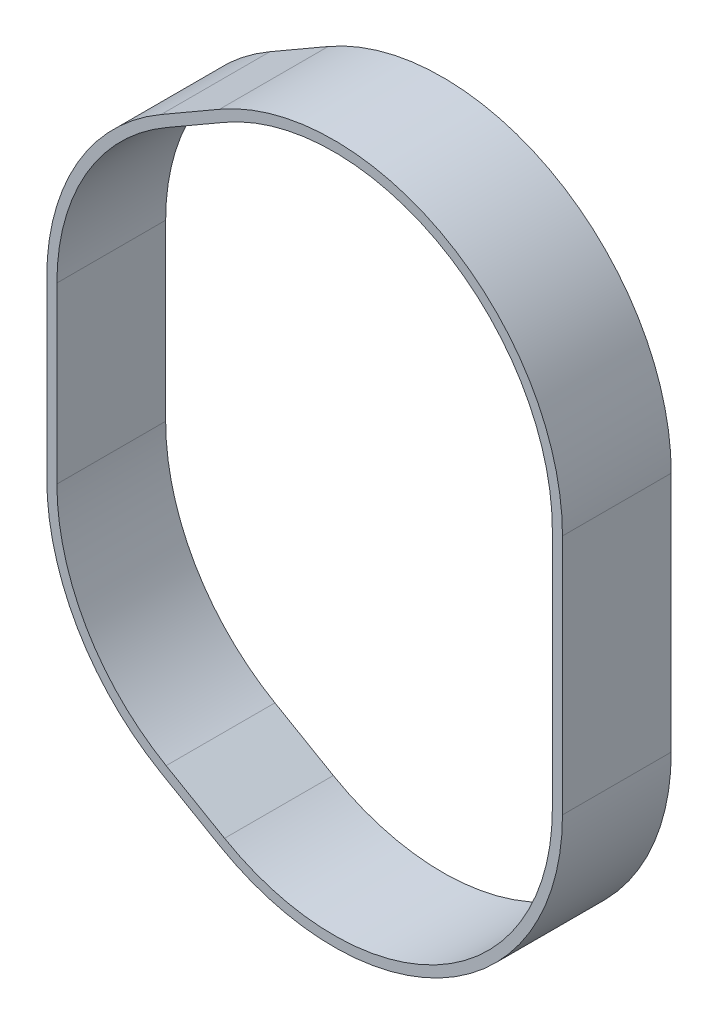
ISO-10303-21;
HEADER;
FILE_DESCRIPTION(('STEP AP214'),'2;1');
FILE_NAME('part.step','',(''),(''),'','','');
FILE_SCHEMA(('AUTOMOTIVE_DESIGN { 1 0 10303 214 1 1 1 1 }'));
ENDSEC;
DATA;
#1=APPLICATION_CONTEXT('core data for automotive mechanical design processes');
#2=APPLICATION_PROTOCOL_DEFINITION('international standard','automotive_design',2000,#1);
#3=PRODUCT_CONTEXT('',#1,'mechanical');
#4=PRODUCT('Part','Part','',(#3));
#5=PRODUCT_RELATED_PRODUCT_CATEGORY('part','',(#4));
#6=PRODUCT_DEFINITION_FORMATION('','',#4);
#7=PRODUCT_DEFINITION_CONTEXT('part definition',#1,'design');
#8=PRODUCT_DEFINITION('design','',#6,#7);
#9=PRODUCT_DEFINITION_SHAPE('','',#8);
#10=(LENGTH_UNIT() NAMED_UNIT(*) SI_UNIT(.MILLI.,.METRE.));
#11=(NAMED_UNIT(*) PLANE_ANGLE_UNIT() SI_UNIT($,.RADIAN.));
#12=(NAMED_UNIT(*) SI_UNIT($,.STERADIAN.) SOLID_ANGLE_UNIT());
#13=UNCERTAINTY_MEASURE_WITH_UNIT(LENGTH_MEASURE(1.E-05),#10,'distance_accuracy_value','');
#14=(GEOMETRIC_REPRESENTATION_CONTEXT(3) GLOBAL_UNCERTAINTY_ASSIGNED_CONTEXT((#13)) GLOBAL_UNIT_ASSIGNED_CONTEXT((#10,
#11,#12)) REPRESENTATION_CONTEXT('',''));
#15=CARTESIAN_POINT('',(0.,0.,0.));
#16=DIRECTION('',(0.,0.,1.));
#17=DIRECTION('',(1.,0.,0.));
#18=AXIS2_PLACEMENT_3D('',#15,#16,#17);
#19=CARTESIAN_POINT('',(181.562482571108,-4.12570780554714E-13,43.5));
#20=DIRECTION('',(-1.,0.,0.));
#21=DIRECTION('',(0.,-1.,0.));
#22=AXIS2_PLACEMENT_3D('',#19,#20,#21);
#23=PLANE('',#22);
#24=DIRECTION('',(0.,1.,0.));
#25=VECTOR('',#24,1.);
#26=CARTESIAN_POINT('',(181.562482571108,-4.12570780554714E-13,21.5));
#27=LINE('',#26,#25);
#28=CARTESIAN_POINT('',(181.562482571108,-24.4291232025115,21.5));
#29=VERTEX_POINT('',#28);
#30=CARTESIAN_POINT('',(181.562482571109,24.4291232025113,21.5));
#31=VERTEX_POINT('',#30);
#32=EDGE_CURVE('E211',#29,#31,#27,.T.);
#33=ORIENTED_EDGE('',*,*,#32,.T.);
#34=DIRECTION('',(0.,0.,-1.));
#35=VECTOR('',#34,1.);
#36=CARTESIAN_POINT('',(181.562482571109,24.4291232025113,43.5));
#37=LINE('',#36,#35);
#38=CARTESIAN_POINT('',(181.562482571109,24.4291232025113,43.5));
#39=VERTEX_POINT('',#38);
#40=EDGE_CURVE('E218',#39,#31,#37,.T.);
#41=ORIENTED_EDGE('',*,*,#40,.F.);
#42=DIRECTION('',(0.,1.,0.));
#43=VECTOR('',#42,1.);
#44=CARTESIAN_POINT('',(181.562482571108,-4.12570780554714E-13,43.5));
#45=LINE('',#44,#43);
#46=CARTESIAN_POINT('',(181.562482571108,-24.4291232025115,43.5));
#47=VERTEX_POINT('',#46);
#48=EDGE_CURVE('E187',#47,#39,#45,.T.);
#49=ORIENTED_EDGE('',*,*,#48,.F.);
#50=DIRECTION('',(0.,0.,-1.));
#51=VECTOR('',#50,1.);
#52=CARTESIAN_POINT('',(181.562482571108,-24.4291232025115,43.5));
#53=LINE('',#52,#51);
#54=EDGE_CURVE('E214',#47,#29,#53,.T.);
#55=ORIENTED_EDGE('',*,*,#54,.T.);
#56=EDGE_LOOP('',(#33,#41,#49,#55));
#57=FACE_BOUND('',#56,.T.);
#58=ADVANCED_FACE('F36',(#57),#23,.F.);
#59=CARTESIAN_POINT('',(135.312482571108,24.4291232025113,43.5));
#60=DIRECTION('',(0.,0.,-1.));
#61=DIRECTION('',(-1.,0.,0.));
#62=AXIS2_PLACEMENT_3D('',#59,#60,#61);
#63=CYLINDRICAL_SURFACE('',#62,46.2499999999999);
#64=CARTESIAN_POINT('',(135.312482571108,24.4291232025113,21.5));
#65=DIRECTION('',(0.,0.,1.));
#66=DIRECTION('',(1.,0.,0.));
#67=AXIS2_PLACEMENT_3D('',#64,#65,#66);
#68=CIRCLE('',#67,46.2499999999999);
#69=CARTESIAN_POINT('',(112.187482571102,64.4827981275377,21.5));
#70=VERTEX_POINT('',#69);
#71=EDGE_CURVE('E215',#31,#70,#68,.T.);
#72=ORIENTED_EDGE('',*,*,#71,.T.);
#73=DIRECTION('',(0.,0.,-1.));
#74=VECTOR('',#73,1.);
#75=CARTESIAN_POINT('',(112.187482571102,64.4827981275377,43.5));
#76=LINE('',#75,#74);
#77=CARTESIAN_POINT('',(112.187482571102,64.4827981275377,43.5));
#78=VERTEX_POINT('',#77);
#79=EDGE_CURVE('E222',#78,#70,#76,.T.);
#80=ORIENTED_EDGE('',*,*,#79,.F.);
#81=CARTESIAN_POINT('',(135.312482571108,24.4291232025113,43.5));
#82=DIRECTION('',(0.,0.,1.));
#83=DIRECTION('',(1.,0.,0.));
#84=AXIS2_PLACEMENT_3D('',#81,#82,#83);
#85=CIRCLE('',#84,46.2499999999999);
#86=EDGE_CURVE('E190',#39,#78,#85,.T.);
#87=ORIENTED_EDGE('',*,*,#86,.F.);
#88=ORIENTED_EDGE('',*,*,#40,.T.);
#89=EDGE_LOOP('',(#72,#80,#87,#88));
#90=FACE_BOUND('',#89,.T.);
#91=ADVANCED_FACE('F260',(#90),#63,.T.);
#92=CARTESIAN_POINT('',(0.125000000003151,-0.216506350951542,43.5));
#93=DIRECTION('',(0.500000000000043,-0.866025403784414,0.));
#94=DIRECTION('',(0.866025403784414,0.500000000000043,0.));
#95=AXIS2_PLACEMENT_3D('',#92,#93,#94);
#96=PLANE('',#95);
#97=DIRECTION('',(-0.866025403784414,-0.500000000000043,0.));
#98=VECTOR('',#97,1.);
#99=CARTESIAN_POINT('',(0.125000000003151,-0.216506350951542,21.5));
#100=LINE('',#99,#98);
#101=CARTESIAN_POINT('',(100.37499999995,57.6628581352844,21.5));
#102=VERTEX_POINT('',#101);
#103=EDGE_CURVE('E219',#70,#102,#100,.T.);
#104=ORIENTED_EDGE('',*,*,#103,.T.);
#105=DIRECTION('',(0.,0.,-1.));
#106=VECTOR('',#105,1.);
#107=CARTESIAN_POINT('',(100.37499999995,57.6628581352844,43.5));
#108=LINE('',#107,#106);
#109=CARTESIAN_POINT('',(100.37499999995,57.6628581352844,43.5));
#110=VERTEX_POINT('',#109);
#111=EDGE_CURVE('E226',#110,#102,#108,.T.);
#112=ORIENTED_EDGE('',*,*,#111,.F.);
#113=DIRECTION('',(-0.866025403784414,-0.500000000000043,0.));
#114=VECTOR('',#113,1.);
#115=CARTESIAN_POINT('',(0.125000000003151,-0.216506350951542,43.5));
#116=LINE('',#115,#114);
#117=EDGE_CURVE('E194',#78,#110,#116,.T.);
#118=ORIENTED_EDGE('',*,*,#117,.F.);
#119=ORIENTED_EDGE('',*,*,#79,.T.);
#120=EDGE_LOOP('',(#104,#112,#118,#119));
#121=FACE_BOUND('',#120,.T.);
#122=ADVANCED_FACE('F304',(#121),#96,.F.);
#123=CARTESIAN_POINT('',(123.5,17.6091832102842,43.5));
#124=DIRECTION('',(0.,0.,-1.));
#125=DIRECTION('',(-1.,0.,0.));
#126=AXIS2_PLACEMENT_3D('',#123,#124,#125);
#127=CYLINDRICAL_SURFACE('',#126,46.249999999999);
#128=CARTESIAN_POINT('',(123.5,17.6091832102842,21.5));
#129=DIRECTION('',(0.,0.,1.));
#130=DIRECTION('',(1.,0.,0.));
#131=AXIS2_PLACEMENT_3D('',#128,#129,#130);
#132=CIRCLE('',#131,46.249999999999);
#133=CARTESIAN_POINT('',(77.2500000000009,17.6091832102842,21.5));
#134=VERTEX_POINT('',#133);
#135=EDGE_CURVE('E223',#102,#134,#132,.T.);
#136=ORIENTED_EDGE('',*,*,#135,.T.);
#137=DIRECTION('',(0.,0.,-1.));
#138=VECTOR('',#137,1.);
#139=CARTESIAN_POINT('',(77.2500000000009,17.6091832102842,43.5));
#140=LINE('',#139,#138);
#141=CARTESIAN_POINT('',(77.2500000000009,17.6091832102842,43.5));
#142=VERTEX_POINT('',#141);
#143=EDGE_CURVE('E230',#142,#134,#140,.T.);
#144=ORIENTED_EDGE('',*,*,#143,.F.);
#145=CARTESIAN_POINT('',(123.5,17.6091832102842,43.5));
#146=DIRECTION('',(0.,0.,1.));
#147=DIRECTION('',(1.,0.,0.));
#148=AXIS2_PLACEMENT_3D('',#145,#146,#147);
#149=CIRCLE('',#148,46.249999999999);
#150=EDGE_CURVE('E197',#110,#142,#149,.T.);
#151=ORIENTED_EDGE('',*,*,#150,.F.);
#152=ORIENTED_EDGE('',*,*,#111,.T.);
#153=EDGE_LOOP('',(#136,#144,#151,#152));
#154=FACE_BOUND('',#153,.T.);
#155=ADVANCED_FACE('F307',(#154),#127,.T.);
#156=CARTESIAN_POINT('',(77.2500000000004,-1.94818186915581E-12,43.5));
#157=DIRECTION('',(1.,0.,0.));
#158=DIRECTION('',(0.,1.,0.));
#159=AXIS2_PLACEMENT_3D('',#156,#157,#158);
#160=PLANE('',#159);
#161=DIRECTION('',(0.,-1.,0.));
#162=VECTOR('',#161,1.);
#163=CARTESIAN_POINT('',(77.2500000000004,-1.94818186915581E-12,21.5));
#164=LINE('',#163,#162);
#165=CARTESIAN_POINT('',(77.25,-17.6091832102831,21.5));
#166=VERTEX_POINT('',#165);
#167=EDGE_CURVE('E227',#134,#166,#164,.T.);
#168=ORIENTED_EDGE('',*,*,#167,.T.);
#169=DIRECTION('',(0.,0.,-1.));
#170=VECTOR('',#169,1.);
#171=CARTESIAN_POINT('',(77.25,-17.6091832102831,43.5));
#172=LINE('',#171,#170);
#173=CARTESIAN_POINT('',(77.25,-17.6091832102831,43.5));
#174=VERTEX_POINT('',#173);
#175=EDGE_CURVE('E234',#174,#166,#172,.T.);
#176=ORIENTED_EDGE('',*,*,#175,.F.);
#177=DIRECTION('',(0.,-1.,0.));
#178=VECTOR('',#177,1.);
#179=CARTESIAN_POINT('',(77.2500000000004,-1.94818186915581E-12,43.5));
#180=LINE('',#179,#178);
#181=EDGE_CURVE('E200',#142,#174,#180,.T.);
#182=ORIENTED_EDGE('',*,*,#181,.F.);
#183=ORIENTED_EDGE('',*,*,#143,.T.);
#184=EDGE_LOOP('',(#168,#176,#182,#183));
#185=FACE_BOUND('',#184,.T.);
#186=ADVANCED_FACE('F312',(#185),#160,.F.);
#187=CARTESIAN_POINT('',(123.5,-17.6091832102842,43.5));
#188=DIRECTION('',(0.,0.,-1.));
#189=DIRECTION('',(-1.,0.,0.));
#190=AXIS2_PLACEMENT_3D('',#187,#188,#189);
#191=CYLINDRICAL_SURFACE('',#190,46.25);
#192=CARTESIAN_POINT('',(123.5,-17.6091832102842,21.5));
#193=DIRECTION('',(0.,0.,1.));
#194=DIRECTION('',(1.,0.,0.));
#195=AXIS2_PLACEMENT_3D('',#192,#193,#194);
#196=CIRCLE('',#195,46.25);
#197=CARTESIAN_POINT('',(100.375,-57.6628581353144,21.5));
#198=VERTEX_POINT('',#197);
#199=EDGE_CURVE('E231',#166,#198,#196,.T.);
#200=ORIENTED_EDGE('',*,*,#199,.T.);
#201=DIRECTION('',(0.,0.,-1.));
#202=VECTOR('',#201,1.);
#203=CARTESIAN_POINT('',(100.375,-57.6628581353144,43.5));
#204=LINE('',#203,#202);
#205=CARTESIAN_POINT('',(100.375,-57.6628581353144,43.5));
#206=VERTEX_POINT('',#205);
#207=EDGE_CURVE('E238',#206,#198,#204,.T.);
#208=ORIENTED_EDGE('',*,*,#207,.F.);
#209=CARTESIAN_POINT('',(123.5,-17.6091832102842,43.5));
#210=DIRECTION('',(0.,0.,1.));
#211=DIRECTION('',(1.,0.,0.));
#212=AXIS2_PLACEMENT_3D('',#209,#210,#211);
#213=CIRCLE('',#212,46.25);
#214=EDGE_CURVE('E203',#174,#206,#213,.T.);
#215=ORIENTED_EDGE('',*,*,#214,.F.);
#216=ORIENTED_EDGE('',*,*,#175,.T.);
#217=EDGE_LOOP('',(#200,#208,#215,#216));
#218=FACE_BOUND('',#217,.T.);
#219=ADVANCED_FACE('F318',(#218),#191,.T.);
#220=CARTESIAN_POINT('',(0.124999999999994,0.216506350946097,43.5));
#221=DIRECTION('',(0.500000000000004,0.866025403784436,0.));
#222=DIRECTION('',(-0.866025403784436,0.500000000000004,0.));
#223=AXIS2_PLACEMENT_3D('',#220,#221,#222);
#224=PLANE('',#223);
#225=DIRECTION('',(0.866025403784436,-0.500000000000004,0.));
#226=VECTOR('',#225,1.);
#227=CARTESIAN_POINT('',(0.124999999999994,0.216506350946097,21.5));
#228=LINE('',#227,#226);
#229=CARTESIAN_POINT('',(112.187482571108,-64.4827981275417,21.5));
#230=VERTEX_POINT('',#229);
#231=EDGE_CURVE('E235',#198,#230,#228,.T.);
#232=ORIENTED_EDGE('',*,*,#231,.T.);
#233=DIRECTION('',(0.,0.,-1.));
#234=VECTOR('',#233,1.);
#235=CARTESIAN_POINT('',(112.187482571108,-64.4827981275417,43.5));
#236=LINE('',#235,#234);
#237=CARTESIAN_POINT('',(112.187482571108,-64.4827981275417,43.5));
#238=VERTEX_POINT('',#237);
#239=EDGE_CURVE('E191',#238,#230,#236,.T.);
#240=ORIENTED_EDGE('',*,*,#239,.F.);
#241=DIRECTION('',(0.866025403784436,-0.500000000000004,0.));
#242=VECTOR('',#241,1.);
#243=CARTESIAN_POINT('',(0.124999999999994,0.216506350946097,43.5));
#244=LINE('',#243,#242);
#245=EDGE_CURVE('E206',#206,#238,#244,.T.);
#246=ORIENTED_EDGE('',*,*,#245,.F.);
#247=ORIENTED_EDGE('',*,*,#207,.T.);
#248=EDGE_LOOP('',(#232,#240,#246,#247));
#249=FACE_BOUND('',#248,.T.);
#250=ADVANCED_FACE('F321',(#249),#224,.F.);
#251=CARTESIAN_POINT('',(135.312482571108,-24.4291232025115,43.5));
#252=DIRECTION('',(0.,0.,-1.));
#253=DIRECTION('',(-1.,0.,0.));
#254=AXIS2_PLACEMENT_3D('',#251,#252,#253);
#255=CYLINDRICAL_SURFACE('',#254,46.25);
#256=CARTESIAN_POINT('',(135.312482571108,-24.4291232025115,21.5));
#257=DIRECTION('',(0.,0.,1.));
#258=DIRECTION('',(1.,0.,0.));
#259=AXIS2_PLACEMENT_3D('',#256,#257,#258);
#260=CIRCLE('',#259,46.25);
#261=EDGE_CURVE('E239',#230,#29,#260,.T.);
#262=ORIENTED_EDGE('',*,*,#261,.T.);
#263=ORIENTED_EDGE('',*,*,#54,.F.);
#264=CARTESIAN_POINT('',(135.312482571108,-24.4291232025115,43.5));
#265=DIRECTION('',(0.,0.,1.));
#266=DIRECTION('',(1.,0.,0.));
#267=AXIS2_PLACEMENT_3D('',#264,#265,#266);
#268=CIRCLE('',#267,46.25);
#269=EDGE_CURVE('E142',#238,#47,#268,.T.);
#270=ORIENTED_EDGE('',*,*,#269,.F.);
#271=ORIENTED_EDGE('',*,*,#239,.T.);
#272=EDGE_LOOP('',(#262,#263,#270,#271));
#273=FACE_BOUND('',#272,.T.);
#274=ADVANCED_FACE('F323',(#273),#255,.T.);
#275=CARTESIAN_POINT('',(0.,0.,43.5));
#276=DIRECTION('',(0.,0.,1.));
#277=DIRECTION('',(1.,0.,0.));
#278=AXIS2_PLACEMENT_3D('',#275,#276,#277);
#279=PLANE('',#278);
#280=CARTESIAN_POINT('',(123.5,17.6091832102842,43.5));
#281=DIRECTION('',(0.,0.,1.));
#282=DIRECTION('',(1.,0.,0.));
#283=AXIS2_PLACEMENT_3D('',#280,#281,#282);
#284=CIRCLE('',#283,44.1999999999989);
#285=CARTESIAN_POINT('',(101.399999999996,55.8875060575528,43.5));
#286=VERTEX_POINT('',#285);
#287=CARTESIAN_POINT('',(79.3000000000011,17.6091832102842,43.5));
#288=VERTEX_POINT('',#287);
#289=EDGE_CURVE('E128',#286,#288,#284,.T.);
#290=ORIENTED_EDGE('',*,*,#289,.F.);
#291=DIRECTION('',(-0.866025403784403,-0.500000000000062,0.));
#292=VECTOR('',#291,1.);
#293=CARTESIAN_POINT('',(113.212482571103,62.7074460497802,43.5));
#294=LINE('',#293,#292);
#295=CARTESIAN_POINT('',(113.212482571103,62.7074460497803,43.5));
#296=VERTEX_POINT('',#295);
#297=EDGE_CURVE('E158',#296,#286,#294,.T.);
#298=ORIENTED_EDGE('',*,*,#297,.F.);
#299=CARTESIAN_POINT('',(135.312482571108,24.4291232025112,43.5));
#300=DIRECTION('',(0.,0.,1.));
#301=DIRECTION('',(1.,0.,0.));
#302=AXIS2_PLACEMENT_3D('',#299,#300,#301);
#303=CIRCLE('',#302,44.2000000000002);
#304=CARTESIAN_POINT('',(179.512482571109,24.4291232025114,43.5));
#305=VERTEX_POINT('',#304);
#306=EDGE_CURVE('E121',#305,#296,#303,.T.);
#307=ORIENTED_EDGE('',*,*,#306,.F.);
#308=DIRECTION('',(0.,1.,0.));
#309=VECTOR('',#308,1.);
#310=CARTESIAN_POINT('',(179.512482571108,-24.4291232025115,43.5));
#311=LINE('',#310,#309);
#312=CARTESIAN_POINT('',(179.512482571108,-24.4291232025115,43.5));
#313=VERTEX_POINT('',#312);
#314=EDGE_CURVE('E118',#313,#305,#311,.T.);
#315=ORIENTED_EDGE('',*,*,#314,.F.);
#316=CARTESIAN_POINT('',(135.312482571108,-24.4291232025115,43.5));
#317=DIRECTION('',(0.,0.,1.));
#318=DIRECTION('',(1.,0.,0.));
#319=AXIS2_PLACEMENT_3D('',#316,#317,#318);
#320=CIRCLE('',#319,44.2);
#321=CARTESIAN_POINT('',(113.212482571108,-62.7074460497832,43.5));
#322=VERTEX_POINT('',#321);
#323=EDGE_CURVE('E152',#322,#313,#320,.T.);
#324=ORIENTED_EDGE('',*,*,#323,.F.);
#325=DIRECTION('',(0.866025403784436,-0.500000000000005,0.));
#326=VECTOR('',#325,1.);
#327=CARTESIAN_POINT('',(101.399999999999,-55.8875060575558,43.5));
#328=LINE('',#327,#326);
#329=CARTESIAN_POINT('',(101.399999999999,-55.8875060575558,43.5));
#330=VERTEX_POINT('',#329);
#331=EDGE_CURVE('E148',#330,#322,#328,.T.);
#332=ORIENTED_EDGE('',*,*,#331,.F.);
#333=CARTESIAN_POINT('',(123.5,-17.6091832102842,43.5));
#334=DIRECTION('',(0.,0.,1.));
#335=DIRECTION('',(1.,0.,0.));
#336=AXIS2_PLACEMENT_3D('',#333,#334,#335);
#337=CIRCLE('',#336,44.2);
#338=CARTESIAN_POINT('',(79.3,-17.6091832102842,43.5));
#339=VERTEX_POINT('',#338);
#340=EDGE_CURVE('E145',#339,#330,#337,.T.);
#341=ORIENTED_EDGE('',*,*,#340,.F.);
#342=DIRECTION('',(0.,-1.,0.));
#343=VECTOR('',#342,1.);
#344=CARTESIAN_POINT('',(79.3000000000011,17.6091832102842,43.5));
#345=LINE('',#344,#343);
#346=EDGE_CURVE('E45',#288,#339,#345,.T.);
#347=ORIENTED_EDGE('',*,*,#346,.F.);
#348=EDGE_LOOP('',(#290,#298,#307,#315,#324,#332,#341,#347));
#349=FACE_BOUND('',#348,.T.);
#350=ORIENTED_EDGE('',*,*,#48,.T.);
#351=ORIENTED_EDGE('',*,*,#86,.T.);
#352=ORIENTED_EDGE('',*,*,#117,.T.);
#353=ORIENTED_EDGE('',*,*,#150,.T.);
#354=ORIENTED_EDGE('',*,*,#181,.T.);
#355=ORIENTED_EDGE('',*,*,#214,.T.);
#356=ORIENTED_EDGE('',*,*,#245,.T.);
#357=ORIENTED_EDGE('',*,*,#269,.T.);
#358=EDGE_LOOP('',(#350,#351,#352,#353,#354,#355,#356,#357));
#359=FACE_BOUND('',#358,.T.);
#360=ADVANCED_FACE('F175',(#349,#359),#279,.T.);
#361=CARTESIAN_POINT('',(0.,0.,21.5));
#362=DIRECTION('',(0.,0.,1.));
#363=DIRECTION('',(1.,0.,0.));
#364=AXIS2_PLACEMENT_3D('',#361,#362,#363);
#365=PLANE('',#364);
#366=DIRECTION('',(-0.866025403784403,-0.500000000000062,0.));
#367=VECTOR('',#366,1.);
#368=CARTESIAN_POINT('',(113.212482571103,62.7074460497802,21.5));
#369=LINE('',#368,#367);
#370=CARTESIAN_POINT('',(113.212482571103,62.7074460497803,21.5));
#371=VERTEX_POINT('',#370);
#372=CARTESIAN_POINT('',(101.399999999996,55.8875060575528,21.5));
#373=VERTEX_POINT('',#372);
#374=EDGE_CURVE('E139',#371,#373,#369,.T.);
#375=ORIENTED_EDGE('',*,*,#374,.T.);
#376=CARTESIAN_POINT('',(123.5,17.6091832102842,21.5));
#377=DIRECTION('',(0.,0.,1.));
#378=DIRECTION('',(1.,0.,0.));
#379=AXIS2_PLACEMENT_3D('',#376,#377,#378);
#380=CIRCLE('',#379,44.1999999999989);
#381=CARTESIAN_POINT('',(79.3000000000011,17.6091832102842,21.5));
#382=VERTEX_POINT('',#381);
#383=EDGE_CURVE('E141',#373,#382,#380,.T.);
#384=ORIENTED_EDGE('',*,*,#383,.T.);
#385=DIRECTION('',(0.,-1.,0.));
#386=VECTOR('',#385,1.);
#387=CARTESIAN_POINT('',(79.3000000000011,17.6091832102842,21.5));
#388=LINE('',#387,#386);
#389=CARTESIAN_POINT('',(79.3,-17.6091832102842,21.5));
#390=VERTEX_POINT('',#389);
#391=EDGE_CURVE('E181',#382,#390,#388,.T.);
#392=ORIENTED_EDGE('',*,*,#391,.T.);
#393=CARTESIAN_POINT('',(123.5,-17.6091832102842,21.5));
#394=DIRECTION('',(0.,0.,1.));
#395=DIRECTION('',(1.,0.,0.));
#396=AXIS2_PLACEMENT_3D('',#393,#394,#395);
#397=CIRCLE('',#396,44.2);
#398=CARTESIAN_POINT('',(101.399999999999,-55.8875060575558,21.5));
#399=VERTEX_POINT('',#398);
#400=EDGE_CURVE('E180',#390,#399,#397,.T.);
#401=ORIENTED_EDGE('',*,*,#400,.T.);
#402=DIRECTION('',(0.866025403784436,-0.500000000000005,0.));
#403=VECTOR('',#402,1.);
#404=CARTESIAN_POINT('',(101.399999999999,-55.8875060575558,21.5));
#405=LINE('',#404,#403);
#406=CARTESIAN_POINT('',(113.212482571108,-62.7074460497832,21.5));
#407=VERTEX_POINT('',#406);
#408=EDGE_CURVE('E135',#399,#407,#405,.T.);
#409=ORIENTED_EDGE('',*,*,#408,.T.);
#410=CARTESIAN_POINT('',(135.312482571108,-24.4291232025115,21.5));
#411=DIRECTION('',(0.,0.,1.));
#412=DIRECTION('',(1.,0.,0.));
#413=AXIS2_PLACEMENT_3D('',#410,#411,#412);
#414=CIRCLE('',#413,44.2);
#415=CARTESIAN_POINT('',(179.512482571108,-24.4291232025115,21.5));
#416=VERTEX_POINT('',#415);
#417=EDGE_CURVE('E133',#407,#416,#414,.T.);
#418=ORIENTED_EDGE('',*,*,#417,.T.);
#419=DIRECTION('',(0.,1.,0.));
#420=VECTOR('',#419,1.);
#421=CARTESIAN_POINT('',(179.512482571108,-24.4291232025115,21.5));
#422=LINE('',#421,#420);
#423=CARTESIAN_POINT('',(179.512482571109,24.4291232025114,21.5));
#424=VERTEX_POINT('',#423);
#425=EDGE_CURVE('E115',#416,#424,#422,.T.);
#426=ORIENTED_EDGE('',*,*,#425,.T.);
#427=CARTESIAN_POINT('',(135.312482571108,24.4291232025112,21.5));
#428=DIRECTION('',(0.,0.,1.));
#429=DIRECTION('',(1.,0.,0.));
#430=AXIS2_PLACEMENT_3D('',#427,#428,#429);
#431=CIRCLE('',#430,44.2000000000002);
#432=EDGE_CURVE('E124',#424,#371,#431,.T.);
#433=ORIENTED_EDGE('',*,*,#432,.T.);
#434=EDGE_LOOP('',(#375,#384,#392,#401,#409,#418,#426,#433));
#435=FACE_BOUND('',#434,.T.);
#436=ORIENTED_EDGE('',*,*,#32,.F.);
#437=ORIENTED_EDGE('',*,*,#261,.F.);
#438=ORIENTED_EDGE('',*,*,#231,.F.);
#439=ORIENTED_EDGE('',*,*,#199,.F.);
#440=ORIENTED_EDGE('',*,*,#167,.F.);
#441=ORIENTED_EDGE('',*,*,#135,.F.);
#442=ORIENTED_EDGE('',*,*,#103,.F.);
#443=ORIENTED_EDGE('',*,*,#71,.F.);
#444=EDGE_LOOP('',(#436,#437,#438,#439,#440,#441,#442,#443));
#445=FACE_BOUND('',#444,.T.);
#446=ADVANCED_FACE('F38',(#435,#445),#365,.F.);
#447=CARTESIAN_POINT('',(123.5,17.6091832102842,21.5));
#448=DIRECTION('',(0.,0.,1.));
#449=DIRECTION('',(1.,0.,0.));
#450=AXIS2_PLACEMENT_3D('',#447,#448,#449);
#451=CYLINDRICAL_SURFACE('',#450,44.1999999999989);
#452=ORIENTED_EDGE('',*,*,#289,.T.);
#453=DIRECTION('',(0.,0.,1.));
#454=VECTOR('',#453,1.);
#455=CARTESIAN_POINT('',(79.3000000000011,17.6091832102842,21.5));
#456=LINE('',#455,#454);
#457=EDGE_CURVE('E11',#382,#288,#456,.T.);
#458=ORIENTED_EDGE('',*,*,#457,.F.);
#459=ORIENTED_EDGE('',*,*,#383,.F.);
#460=DIRECTION('',(0.,0.,1.));
#461=VECTOR('',#460,1.);
#462=CARTESIAN_POINT('',(101.399999999996,55.8875060575528,21.5));
#463=LINE('',#462,#461);
#464=EDGE_CURVE('E86',#373,#286,#463,.T.);
#465=ORIENTED_EDGE('',*,*,#464,.T.);
#466=EDGE_LOOP('',(#452,#458,#459,#465));
#467=FACE_BOUND('',#466,.T.);
#468=ADVANCED_FACE('F376',(#467),#451,.F.);
#469=CARTESIAN_POINT('',(113.212482571103,62.7074460497802,21.5));
#470=DIRECTION('',(-0.500000000000062,0.866025403784403,0.));
#471=DIRECTION('',(-0.866025403784403,-0.500000000000062,0.));
#472=AXIS2_PLACEMENT_3D('',#469,#470,#471);
#473=PLANE('',#472);
#474=ORIENTED_EDGE('',*,*,#297,.T.);
#475=ORIENTED_EDGE('',*,*,#464,.F.);
#476=ORIENTED_EDGE('',*,*,#374,.F.);
#477=DIRECTION('',(0.,0.,1.));
#478=VECTOR('',#477,1.);
#479=CARTESIAN_POINT('',(113.212482571103,62.7074460497803,21.5));
#480=LINE('',#479,#478);
#481=EDGE_CURVE('E82',#371,#296,#480,.T.);
#482=ORIENTED_EDGE('',*,*,#481,.T.);
#483=EDGE_LOOP('',(#474,#475,#476,#482));
#484=FACE_BOUND('',#483,.T.);
#485=ADVANCED_FACE('F384',(#484),#473,.F.);
#486=CARTESIAN_POINT('',(135.312482571108,24.4291232025112,21.5));
#487=DIRECTION('',(0.,0.,1.));
#488=DIRECTION('',(1.,0.,0.));
#489=AXIS2_PLACEMENT_3D('',#486,#487,#488);
#490=CYLINDRICAL_SURFACE('',#489,44.2000000000002);
#491=ORIENTED_EDGE('',*,*,#306,.T.);
#492=ORIENTED_EDGE('',*,*,#481,.F.);
#493=ORIENTED_EDGE('',*,*,#432,.F.);
#494=DIRECTION('',(0.,0.,1.));
#495=VECTOR('',#494,1.);
#496=CARTESIAN_POINT('',(179.512482571109,24.4291232025114,21.5));
#497=LINE('',#496,#495);
#498=EDGE_CURVE('E111',#424,#305,#497,.T.);
#499=ORIENTED_EDGE('',*,*,#498,.T.);
#500=EDGE_LOOP('',(#491,#492,#493,#499));
#501=FACE_BOUND('',#500,.T.);
#502=ADVANCED_FACE('F125',(#501),#490,.F.);
#503=CARTESIAN_POINT('',(179.512482571108,-24.4291232025115,21.5));
#504=DIRECTION('',(1.,0.,0.));
#505=DIRECTION('',(0.,1.,0.));
#506=AXIS2_PLACEMENT_3D('',#503,#504,#505);
#507=PLANE('',#506);
#508=ORIENTED_EDGE('',*,*,#314,.T.);
#509=ORIENTED_EDGE('',*,*,#498,.F.);
#510=ORIENTED_EDGE('',*,*,#425,.F.);
#511=DIRECTION('',(0.,0.,1.));
#512=VECTOR('',#511,1.);
#513=CARTESIAN_POINT('',(179.512482571108,-24.4291232025115,21.5));
#514=LINE('',#513,#512);
#515=EDGE_CURVE('E155',#416,#313,#514,.T.);
#516=ORIENTED_EDGE('',*,*,#515,.T.);
#517=EDGE_LOOP('',(#508,#509,#510,#516));
#518=FACE_BOUND('',#517,.T.);
#519=ADVANCED_FACE('F113',(#518),#507,.F.);
#520=CARTESIAN_POINT('',(135.312482571108,-24.4291232025115,21.5));
#521=DIRECTION('',(0.,0.,1.));
#522=DIRECTION('',(1.,0.,0.));
#523=AXIS2_PLACEMENT_3D('',#520,#521,#522);
#524=CYLINDRICAL_SURFACE('',#523,44.2);
#525=ORIENTED_EDGE('',*,*,#323,.T.);
#526=ORIENTED_EDGE('',*,*,#515,.F.);
#527=ORIENTED_EDGE('',*,*,#417,.F.);
#528=DIRECTION('',(0.,0.,1.));
#529=VECTOR('',#528,1.);
#530=CARTESIAN_POINT('',(113.212482571108,-62.7074460497832,21.5));
#531=LINE('',#530,#529);
#532=EDGE_CURVE('E151',#407,#322,#531,.T.);
#533=ORIENTED_EDGE('',*,*,#532,.T.);
#534=EDGE_LOOP('',(#525,#526,#527,#533));
#535=FACE_BOUND('',#534,.T.);
#536=ADVANCED_FACE('F178',(#535),#524,.F.);
#537=CARTESIAN_POINT('',(101.399999999999,-55.8875060575558,21.5));
#538=DIRECTION('',(-0.500000000000005,-0.866025403784436,0.));
#539=DIRECTION('',(0.866025403784436,-0.500000000000005,0.));
#540=AXIS2_PLACEMENT_3D('',#537,#538,#539);
#541=PLANE('',#540);
#542=ORIENTED_EDGE('',*,*,#331,.T.);
#543=ORIENTED_EDGE('',*,*,#532,.F.);
#544=ORIENTED_EDGE('',*,*,#408,.F.);
#545=DIRECTION('',(0.,0.,1.));
#546=VECTOR('',#545,1.);
#547=CARTESIAN_POINT('',(101.399999999999,-55.8875060575558,21.5));
#548=LINE('',#547,#546);
#549=EDGE_CURVE('E147',#399,#330,#548,.T.);
#550=ORIENTED_EDGE('',*,*,#549,.T.);
#551=EDGE_LOOP('',(#542,#543,#544,#550));
#552=FACE_BOUND('',#551,.T.);
#553=ADVANCED_FACE('F166',(#552),#541,.F.);
#554=CARTESIAN_POINT('',(123.5,-17.6091832102842,21.5));
#555=DIRECTION('',(0.,0.,1.));
#556=DIRECTION('',(1.,0.,0.));
#557=AXIS2_PLACEMENT_3D('',#554,#555,#556);
#558=CYLINDRICAL_SURFACE('',#557,44.2);
#559=ORIENTED_EDGE('',*,*,#340,.T.);
#560=ORIENTED_EDGE('',*,*,#549,.F.);
#561=ORIENTED_EDGE('',*,*,#400,.F.);
#562=DIRECTION('',(0.,0.,1.));
#563=VECTOR('',#562,1.);
#564=CARTESIAN_POINT('',(79.3,-17.6091832102842,21.5));
#565=LINE('',#564,#563);
#566=EDGE_CURVE('E53',#390,#339,#565,.T.);
#567=ORIENTED_EDGE('',*,*,#566,.T.);
#568=EDGE_LOOP('',(#559,#560,#561,#567));
#569=FACE_BOUND('',#568,.T.);
#570=ADVANCED_FACE('F171',(#569),#558,.F.);
#571=CARTESIAN_POINT('',(79.3000000000011,17.6091832102842,21.5));
#572=DIRECTION('',(-1.,0.,0.));
#573=DIRECTION('',(0.,-1.,0.));
#574=AXIS2_PLACEMENT_3D('',#571,#572,#573);
#575=PLANE('',#574);
#576=ORIENTED_EDGE('',*,*,#346,.T.);
#577=ORIENTED_EDGE('',*,*,#566,.F.);
#578=ORIENTED_EDGE('',*,*,#391,.F.);
#579=ORIENTED_EDGE('',*,*,#457,.T.);
#580=EDGE_LOOP('',(#576,#577,#578,#579));
#581=FACE_BOUND('',#580,.T.);
#582=ADVANCED_FACE('F432',(#581),#575,.F.);
#583=CLOSED_SHELL('',(#58,#91,#122,#155,#186,#219,#250,#274,#360,#446,#468,#485,#502,#519,#536,
#553,#570,#582));
#584=MANIFOLD_SOLID_BREP('B2',#583);
#585=ADVANCED_BREP_SHAPE_REPRESENTATION('',(#18,#584),#14);
#586=SHAPE_DEFINITION_REPRESENTATION(#9,#585);
ENDSEC;
END-ISO-10303-21;
